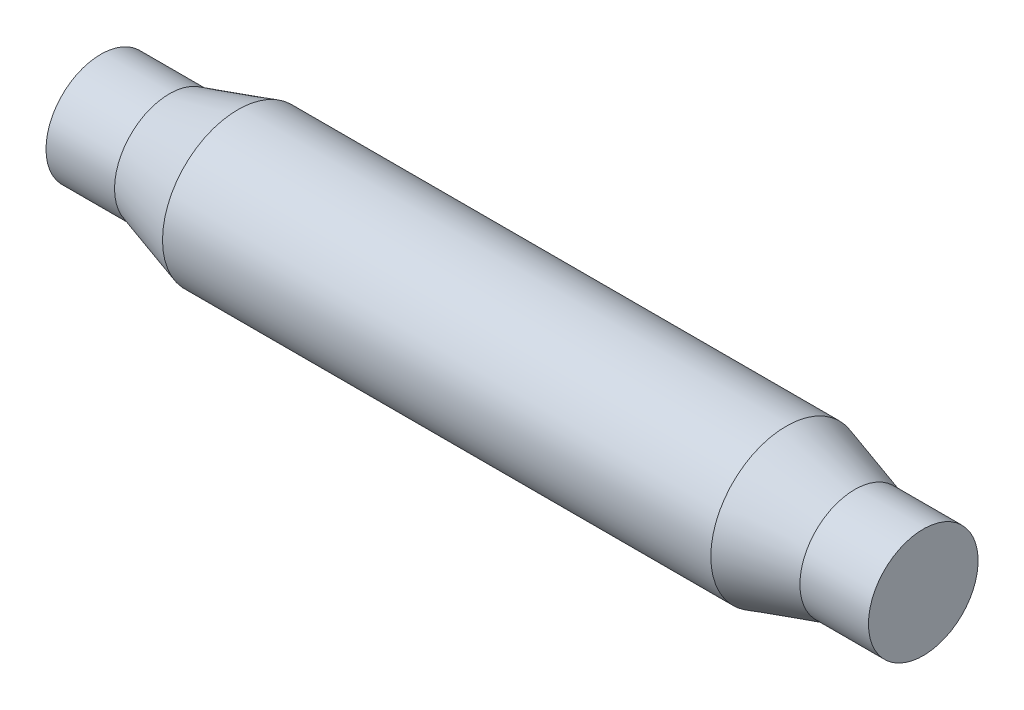
ISO-10303-21;
HEADER;
FILE_DESCRIPTION(('STEP AP214'),'2;1');
FILE_NAME('part.step','',(''),(''),'','','');
FILE_SCHEMA(('AUTOMOTIVE_DESIGN { 1 0 10303 214 1 1 1 1 }'));
ENDSEC;
DATA;
#1=APPLICATION_CONTEXT('core data for automotive mechanical design processes');
#2=APPLICATION_PROTOCOL_DEFINITION('international standard','automotive_design',2000,#1);
#3=PRODUCT_CONTEXT('',#1,'mechanical');
#4=PRODUCT('Part','Part','',(#3));
#5=PRODUCT_RELATED_PRODUCT_CATEGORY('part','',(#4));
#6=PRODUCT_DEFINITION_FORMATION('','',#4);
#7=PRODUCT_DEFINITION_CONTEXT('part definition',#1,'design');
#8=PRODUCT_DEFINITION('design','',#6,#7);
#9=PRODUCT_DEFINITION_SHAPE('','',#8);
#10=(LENGTH_UNIT() NAMED_UNIT(*) SI_UNIT(.MILLI.,.METRE.));
#11=(NAMED_UNIT(*) PLANE_ANGLE_UNIT() SI_UNIT($,.RADIAN.));
#12=(NAMED_UNIT(*) SI_UNIT($,.STERADIAN.) SOLID_ANGLE_UNIT());
#13=UNCERTAINTY_MEASURE_WITH_UNIT(LENGTH_MEASURE(1.E-05),#10,'distance_accuracy_value','');
#14=(GEOMETRIC_REPRESENTATION_CONTEXT(3) GLOBAL_UNCERTAINTY_ASSIGNED_CONTEXT((#13)) GLOBAL_UNIT_ASSIGNED_CONTEXT((#10,
#11,#12)) REPRESENTATION_CONTEXT('',''));
#15=CARTESIAN_POINT('',(0.,0.,0.));
#16=DIRECTION('',(0.,0.,1.));
#17=DIRECTION('',(1.,0.,0.));
#18=AXIS2_PLACEMENT_3D('',#15,#16,#17);
#19=CARTESIAN_POINT('',(30.,0.,0.));
#20=DIRECTION('',(-1.,0.,0.));
#21=DIRECTION('',(0.,0.,1.));
#22=AXIS2_PLACEMENT_3D('',#19,#20,#21);
#23=PLANE('',#22);
#24=CARTESIAN_POINT('',(30.,0.,0.));
#25=DIRECTION('',(-1.,0.,0.));
#26=DIRECTION('',(0.,0.,1.));
#27=AXIS2_PLACEMENT_3D('',#24,#25,#26);
#28=CIRCLE('',#27,4.);
#29=CARTESIAN_POINT('',(30.,0.,4.));
#30=VERTEX_POINT('',#29);
#31=EDGE_CURVE('E10',#30,#30,#28,.T.);
#32=ORIENTED_EDGE('',*,*,#31,.F.);
#33=EDGE_LOOP('',(#32));
#34=FACE_BOUND('',#33,.T.);
#35=ADVANCED_FACE('F31',(#34),#23,.F.);
#36=CARTESIAN_POINT('',(-30.,0.,0.));
#37=DIRECTION('',(-1.,0.,0.));
#38=DIRECTION('',(0.,0.,1.));
#39=AXIS2_PLACEMENT_3D('',#36,#37,#38);
#40=CYLINDRICAL_SURFACE('',#39,4.);
#41=CARTESIAN_POINT('',(25.,0.,0.));
#42=DIRECTION('',(-1.,0.,0.));
#43=DIRECTION('',(0.,0.,1.));
#44=AXIS2_PLACEMENT_3D('',#41,#42,#43);
#45=CIRCLE('',#44,4.);
#46=CARTESIAN_POINT('',(25.,0.,4.));
#47=VERTEX_POINT('',#46);
#48=EDGE_CURVE('E37',#47,#47,#45,.T.);
#49=ORIENTED_EDGE('',*,*,#48,.F.);
#50=EDGE_LOOP('',(#49));
#51=FACE_BOUND('',#50,.T.);
#52=ORIENTED_EDGE('',*,*,#31,.T.);
#53=EDGE_LOOP('',(#52));
#54=FACE_BOUND('',#53,.T.);
#55=ADVANCED_FACE('F79',(#51,#54),#40,.T.);
#56=CARTESIAN_POINT('',(25.,0.,0.));
#57=DIRECTION('',(-1.,0.,0.));
#58=DIRECTION('',(0.,0.,1.));
#59=AXIS2_PLACEMENT_3D('',#56,#57,#58);
#60=CONICAL_SURFACE('',#59,4.,0.291456794477868);
#61=CARTESIAN_POINT('',(20.,0.,0.));
#62=DIRECTION('',(-1.,0.,0.));
#63=DIRECTION('',(0.,0.,1.));
#64=AXIS2_PLACEMENT_3D('',#61,#62,#63);
#65=CIRCLE('',#64,5.5);
#66=CARTESIAN_POINT('',(20.,0.,5.5));
#67=VERTEX_POINT('',#66);
#68=EDGE_CURVE('E41',#67,#67,#65,.T.);
#69=ORIENTED_EDGE('',*,*,#68,.F.);
#70=EDGE_LOOP('',(#69));
#71=FACE_BOUND('',#70,.T.);
#72=ORIENTED_EDGE('',*,*,#48,.T.);
#73=EDGE_LOOP('',(#72));
#74=FACE_BOUND('',#73,.T.);
#75=ADVANCED_FACE('F74',(#71,#74),#60,.T.);
#76=CARTESIAN_POINT('',(-30.,0.,0.));
#77=DIRECTION('',(-1.,0.,0.));
#78=DIRECTION('',(0.,0.,1.));
#79=AXIS2_PLACEMENT_3D('',#76,#77,#78);
#80=CYLINDRICAL_SURFACE('',#79,5.5);
#81=CARTESIAN_POINT('',(-20.,0.,0.));
#82=DIRECTION('',(-1.,0.,0.));
#83=DIRECTION('',(0.,0.,1.));
#84=AXIS2_PLACEMENT_3D('',#81,#82,#83);
#85=CIRCLE('',#84,5.5);
#86=CARTESIAN_POINT('',(-20.,0.,5.5));
#87=VERTEX_POINT('',#86);
#88=EDGE_CURVE('E45',#87,#87,#85,.T.);
#89=ORIENTED_EDGE('',*,*,#88,.F.);
#90=EDGE_LOOP('',(#89));
#91=FACE_BOUND('',#90,.T.);
#92=ORIENTED_EDGE('',*,*,#68,.T.);
#93=EDGE_LOOP('',(#92));
#94=FACE_BOUND('',#93,.T.);
#95=ADVANCED_FACE('F68',(#91,#94),#80,.T.);
#96=CARTESIAN_POINT('',(-20.,0.,0.));
#97=DIRECTION('',(1.,0.,0.));
#98=DIRECTION('',(0.,0.,-1.));
#99=AXIS2_PLACEMENT_3D('',#96,#97,#98);
#100=CONICAL_SURFACE('',#99,5.5,0.291456794477868);
#101=CARTESIAN_POINT('',(-25.,0.,0.));
#102=DIRECTION('',(-1.,0.,0.));
#103=DIRECTION('',(0.,0.,1.));
#104=AXIS2_PLACEMENT_3D('',#101,#102,#103);
#105=CIRCLE('',#104,3.99999999999999);
#106=CARTESIAN_POINT('',(-25.,0.,4.));
#107=VERTEX_POINT('',#106);
#108=EDGE_CURVE('E50',#107,#107,#105,.T.);
#109=ORIENTED_EDGE('',*,*,#108,.F.);
#110=EDGE_LOOP('',(#109));
#111=FACE_BOUND('',#110,.T.);
#112=ORIENTED_EDGE('',*,*,#88,.T.);
#113=EDGE_LOOP('',(#112));
#114=FACE_BOUND('',#113,.T.);
#115=ADVANCED_FACE('F62',(#111,#114),#100,.T.);
#116=CARTESIAN_POINT('',(-30.,0.,0.));
#117=DIRECTION('',(-1.,0.,0.));
#118=DIRECTION('',(0.,0.,1.));
#119=AXIS2_PLACEMENT_3D('',#116,#117,#118);
#120=CYLINDRICAL_SURFACE('',#119,3.99999999999999);
#121=CARTESIAN_POINT('',(-30.,0.,0.));
#122=DIRECTION('',(-1.,0.,0.));
#123=DIRECTION('',(0.,0.,1.));
#124=AXIS2_PLACEMENT_3D('',#121,#122,#123);
#125=CIRCLE('',#124,3.99999999999999);
#126=CARTESIAN_POINT('',(-30.,0.,4.));
#127=VERTEX_POINT('',#126);
#128=EDGE_CURVE('E53',#127,#127,#125,.T.);
#129=ORIENTED_EDGE('',*,*,#128,.F.);
#130=EDGE_LOOP('',(#129));
#131=FACE_BOUND('',#130,.T.);
#132=ORIENTED_EDGE('',*,*,#108,.T.);
#133=EDGE_LOOP('',(#132));
#134=FACE_BOUND('',#133,.T.);
#135=ADVANCED_FACE('F59',(#131,#134),#120,.T.);
#136=CARTESIAN_POINT('',(-30.,0.,0.));
#137=DIRECTION('',(1.,0.,0.));
#138=DIRECTION('',(0.,0.,-1.));
#139=AXIS2_PLACEMENT_3D('',#136,#137,#138);
#140=PLANE('',#139);
#141=ORIENTED_EDGE('',*,*,#128,.T.);
#142=EDGE_LOOP('',(#141));
#143=FACE_BOUND('',#142,.T.);
#144=ADVANCED_FACE('F57',(#143),#140,.F.);
#145=CLOSED_SHELL('',(#35,#55,#75,#95,#115,#135,#144));
#146=MANIFOLD_SOLID_BREP('B2',#145);
#147=ADVANCED_BREP_SHAPE_REPRESENTATION('',(#18,#146),#14);
#148=SHAPE_DEFINITION_REPRESENTATION(#9,#147);
ENDSEC;
END-ISO-10303-21;
